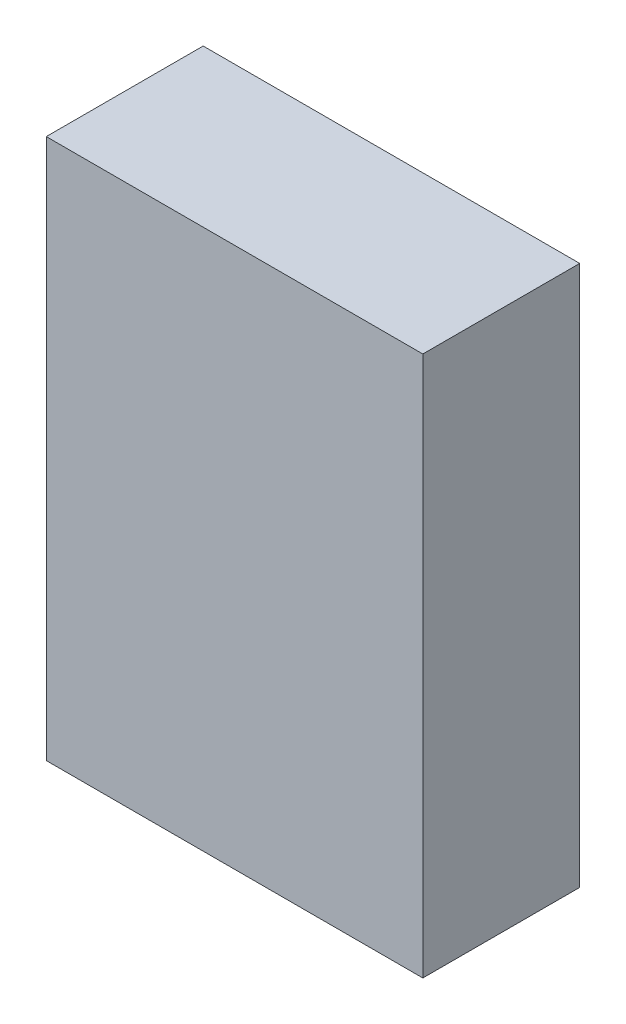
ISO-10303-21;
HEADER;
FILE_DESCRIPTION(('STEP AP214'),'2;1');
FILE_NAME('part.step','',(''),(''),'','','');
FILE_SCHEMA(('AUTOMOTIVE_DESIGN { 1 0 10303 214 1 1 1 1 }'));
ENDSEC;
DATA;
#1=APPLICATION_CONTEXT('core data for automotive mechanical design processes');
#2=APPLICATION_PROTOCOL_DEFINITION('international standard','automotive_design',2000,#1);
#3=PRODUCT_CONTEXT('',#1,'mechanical');
#4=PRODUCT('Part','Part','',(#3));
#5=PRODUCT_RELATED_PRODUCT_CATEGORY('part','',(#4));
#6=PRODUCT_DEFINITION_FORMATION('','',#4);
#7=PRODUCT_DEFINITION_CONTEXT('part definition',#1,'design');
#8=PRODUCT_DEFINITION('design','',#6,#7);
#9=PRODUCT_DEFINITION_SHAPE('','',#8);
#10=(LENGTH_UNIT() NAMED_UNIT(*) SI_UNIT(.MILLI.,.METRE.));
#11=(NAMED_UNIT(*) PLANE_ANGLE_UNIT() SI_UNIT($,.RADIAN.));
#12=(NAMED_UNIT(*) SI_UNIT($,.STERADIAN.) SOLID_ANGLE_UNIT());
#13=UNCERTAINTY_MEASURE_WITH_UNIT(LENGTH_MEASURE(1.E-05),#10,'distance_accuracy_value','');
#14=(GEOMETRIC_REPRESENTATION_CONTEXT(3) GLOBAL_UNCERTAINTY_ASSIGNED_CONTEXT((#13)) GLOBAL_UNIT_ASSIGNED_CONTEXT((#10,
#11,#12)) REPRESENTATION_CONTEXT('',''));
#15=CARTESIAN_POINT('',(0.,0.,0.));
#16=DIRECTION('',(0.,0.,1.));
#17=DIRECTION('',(1.,0.,0.));
#18=AXIS2_PLACEMENT_3D('',#15,#16,#17);
#19=CARTESIAN_POINT('',(-0.54,0.775,0.45));
#20=DIRECTION('',(1.,0.,0.));
#21=DIRECTION('',(0.,0.,-1.));
#22=AXIS2_PLACEMENT_3D('',#19,#20,#21);
#23=PLANE('',#22);
#24=DIRECTION('',(0.,-1.,0.));
#25=VECTOR('',#24,1.);
#26=CARTESIAN_POINT('',(-0.54,0.775,0.));
#27=LINE('',#26,#25);
#28=CARTESIAN_POINT('',(-0.54,0.775,0.));
#29=VERTEX_POINT('',#28);
#30=CARTESIAN_POINT('',(-0.54,-0.775,0.));
#31=VERTEX_POINT('',#30);
#32=EDGE_CURVE('E97',#29,#31,#27,.T.);
#33=ORIENTED_EDGE('',*,*,#32,.T.);
#34=DIRECTION('',(0.,0.,-1.));
#35=VECTOR('',#34,1.);
#36=CARTESIAN_POINT('',(-0.54,-0.775,0.45));
#37=LINE('',#36,#35);
#38=CARTESIAN_POINT('',(-0.54,-0.775,0.45));
#39=VERTEX_POINT('',#38);
#40=EDGE_CURVE('E11',#39,#31,#37,.T.);
#41=ORIENTED_EDGE('',*,*,#40,.F.);
#42=DIRECTION('',(0.,-1.,0.));
#43=VECTOR('',#42,1.);
#44=CARTESIAN_POINT('',(-0.54,0.775,0.45));
#45=LINE('',#44,#43);
#46=CARTESIAN_POINT('',(-0.54,0.775,0.45));
#47=VERTEX_POINT('',#46);
#48=EDGE_CURVE('E85',#47,#39,#45,.T.);
#49=ORIENTED_EDGE('',*,*,#48,.F.);
#50=DIRECTION('',(0.,0.,-1.));
#51=VECTOR('',#50,1.);
#52=CARTESIAN_POINT('',(-0.54,0.775,0.45));
#53=LINE('',#52,#51);
#54=EDGE_CURVE('E93',#47,#29,#53,.T.);
#55=ORIENTED_EDGE('',*,*,#54,.T.);
#56=EDGE_LOOP('',(#33,#41,#49,#55));
#57=FACE_BOUND('',#56,.T.);
#58=ADVANCED_FACE('F34',(#57),#23,.F.);
#59=CARTESIAN_POINT('',(-0.54,-0.775,0.45));
#60=DIRECTION('',(0.,1.,0.));
#61=DIRECTION('',(0.,0.,1.));
#62=AXIS2_PLACEMENT_3D('',#59,#60,#61);
#63=PLANE('',#62);
#64=DIRECTION('',(1.,0.,0.));
#65=VECTOR('',#64,1.);
#66=CARTESIAN_POINT('',(-0.54,-0.775,0.));
#67=LINE('',#66,#65);
#68=CARTESIAN_POINT('',(0.54,-0.775,0.));
#69=VERTEX_POINT('',#68);
#70=EDGE_CURVE('E89',#31,#69,#67,.T.);
#71=ORIENTED_EDGE('',*,*,#70,.T.);
#72=DIRECTION('',(0.,0.,-1.));
#73=VECTOR('',#72,1.);
#74=CARTESIAN_POINT('',(0.54,-0.775,0.45));
#75=LINE('',#74,#73);
#76=CARTESIAN_POINT('',(0.54,-0.775,0.45));
#77=VERTEX_POINT('',#76);
#78=EDGE_CURVE('E42',#77,#69,#75,.T.);
#79=ORIENTED_EDGE('',*,*,#78,.F.);
#80=DIRECTION('',(1.,0.,0.));
#81=VECTOR('',#80,1.);
#82=CARTESIAN_POINT('',(-0.54,-0.775,0.45));
#83=LINE('',#82,#81);
#84=EDGE_CURVE('E80',#39,#77,#83,.T.);
#85=ORIENTED_EDGE('',*,*,#84,.F.);
#86=ORIENTED_EDGE('',*,*,#40,.T.);
#87=EDGE_LOOP('',(#71,#79,#85,#86));
#88=FACE_BOUND('',#87,.T.);
#89=ADVANCED_FACE('F88',(#88),#63,.F.);
#90=CARTESIAN_POINT('',(0.54,-0.775,0.45));
#91=DIRECTION('',(-1.,0.,0.));
#92=DIRECTION('',(0.,0.,1.));
#93=AXIS2_PLACEMENT_3D('',#90,#91,#92);
#94=PLANE('',#93);
#95=DIRECTION('',(0.,1.,0.));
#96=VECTOR('',#95,1.);
#97=CARTESIAN_POINT('',(0.54,-0.775,0.));
#98=LINE('',#97,#96);
#99=CARTESIAN_POINT('',(0.54,0.775,0.));
#100=VERTEX_POINT('',#99);
#101=EDGE_CURVE('E67',#69,#100,#98,.T.);
#102=ORIENTED_EDGE('',*,*,#101,.T.);
#103=DIRECTION('',(0.,0.,-1.));
#104=VECTOR('',#103,1.);
#105=CARTESIAN_POINT('',(0.54,0.775,0.45));
#106=LINE('',#105,#104);
#107=CARTESIAN_POINT('',(0.54,0.775,0.45));
#108=VERTEX_POINT('',#107);
#109=EDGE_CURVE('E90',#108,#100,#106,.T.);
#110=ORIENTED_EDGE('',*,*,#109,.F.);
#111=DIRECTION('',(0.,1.,0.));
#112=VECTOR('',#111,1.);
#113=CARTESIAN_POINT('',(0.54,-0.775,0.45));
#114=LINE('',#113,#112);
#115=EDGE_CURVE('E83',#77,#108,#114,.T.);
#116=ORIENTED_EDGE('',*,*,#115,.F.);
#117=ORIENTED_EDGE('',*,*,#78,.T.);
#118=EDGE_LOOP('',(#102,#110,#116,#117));
#119=FACE_BOUND('',#118,.T.);
#120=ADVANCED_FACE('F91',(#119),#94,.F.);
#121=CARTESIAN_POINT('',(0.54,0.775,0.45));
#122=DIRECTION('',(0.,-1.,0.));
#123=DIRECTION('',(0.,0.,-1.));
#124=AXIS2_PLACEMENT_3D('',#121,#122,#123);
#125=PLANE('',#124);
#126=DIRECTION('',(-1.,0.,0.));
#127=VECTOR('',#126,1.);
#128=CARTESIAN_POINT('',(0.54,0.775,0.));
#129=LINE('',#128,#127);
#130=EDGE_CURVE('E73',#100,#29,#129,.T.);
#131=ORIENTED_EDGE('',*,*,#130,.T.);
#132=ORIENTED_EDGE('',*,*,#54,.F.);
#133=DIRECTION('',(-1.,0.,0.));
#134=VECTOR('',#133,1.);
#135=CARTESIAN_POINT('',(0.54,0.775,0.45));
#136=LINE('',#135,#134);
#137=EDGE_CURVE('E50',#108,#47,#136,.T.);
#138=ORIENTED_EDGE('',*,*,#137,.F.);
#139=ORIENTED_EDGE('',*,*,#109,.T.);
#140=EDGE_LOOP('',(#131,#132,#138,#139));
#141=FACE_BOUND('',#140,.T.);
#142=ADVANCED_FACE('F104',(#141),#125,.F.);
#143=CARTESIAN_POINT('',(0.,0.,0.45));
#144=DIRECTION('',(0.,0.,1.));
#145=DIRECTION('',(1.,0.,0.));
#146=AXIS2_PLACEMENT_3D('',#143,#144,#145);
#147=PLANE('',#146);
#148=ORIENTED_EDGE('',*,*,#48,.T.);
#149=ORIENTED_EDGE('',*,*,#84,.T.);
#150=ORIENTED_EDGE('',*,*,#115,.T.);
#151=ORIENTED_EDGE('',*,*,#137,.T.);
#152=EDGE_LOOP('',(#148,#149,#150,#151));
#153=FACE_BOUND('',#152,.T.);
#154=ADVANCED_FACE('F81',(#153),#147,.T.);
#155=CARTESIAN_POINT('',(0.,0.,0.));
#156=DIRECTION('',(0.,0.,1.));
#157=DIRECTION('',(1.,0.,0.));
#158=AXIS2_PLACEMENT_3D('',#155,#156,#157);
#159=PLANE('',#158);
#160=ORIENTED_EDGE('',*,*,#32,.F.);
#161=ORIENTED_EDGE('',*,*,#130,.F.);
#162=ORIENTED_EDGE('',*,*,#101,.F.);
#163=ORIENTED_EDGE('',*,*,#70,.F.);
#164=EDGE_LOOP('',(#160,#161,#162,#163));
#165=FACE_BOUND('',#164,.T.);
#166=ADVANCED_FACE('F107',(#165),#159,.F.);
#167=CLOSED_SHELL('',(#58,#89,#120,#142,#154,#166));
#168=MANIFOLD_SOLID_BREP('B2',#167);
#169=ADVANCED_BREP_SHAPE_REPRESENTATION('',(#18,#168),#14);
#170=SHAPE_DEFINITION_REPRESENTATION(#9,#169);
ENDSEC;
END-ISO-10303-21;
